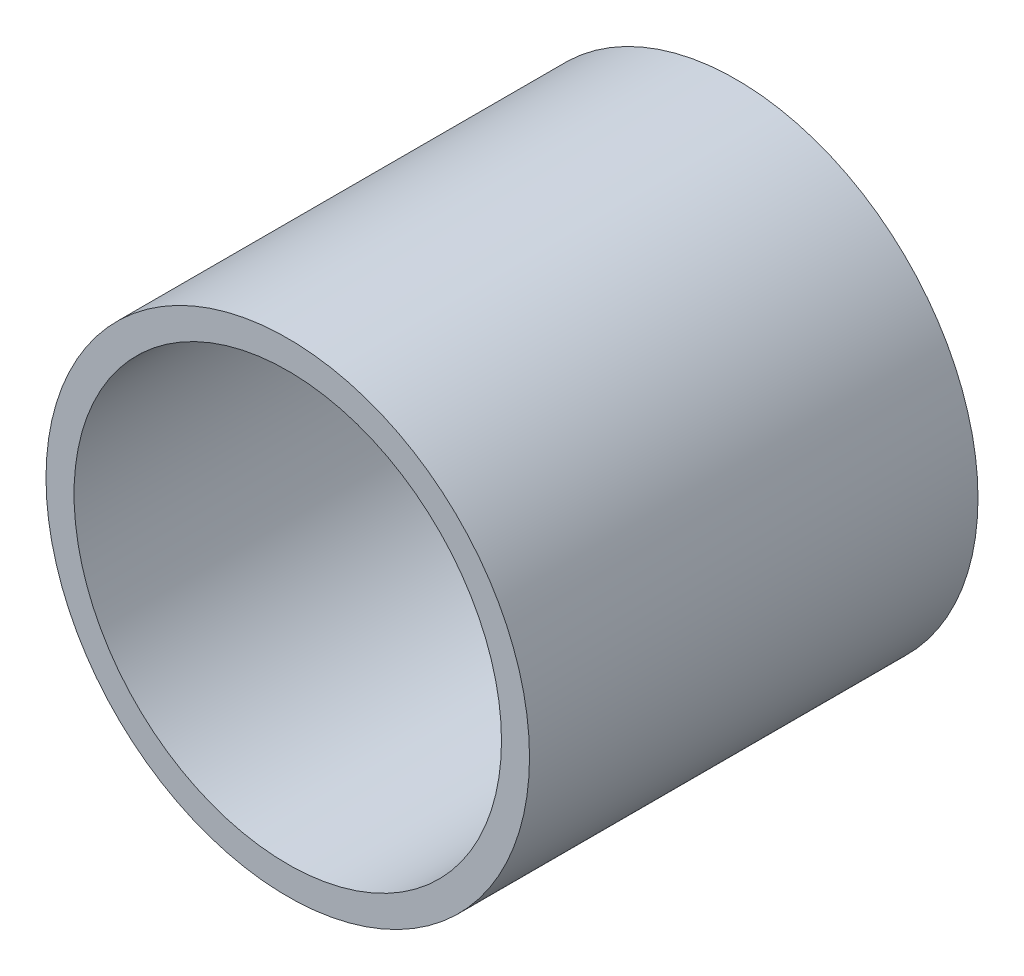
ISO-10303-21;
HEADER;
FILE_DESCRIPTION(('STEP AP214'),'2;1');
FILE_NAME('part.step','',(''),(''),'','','');
FILE_SCHEMA(('AUTOMOTIVE_DESIGN { 1 0 10303 214 1 1 1 1 }'));
ENDSEC;
DATA;
#1=APPLICATION_CONTEXT('core data for automotive mechanical design processes');
#2=APPLICATION_PROTOCOL_DEFINITION('international standard','automotive_design',2000,#1);
#3=PRODUCT_CONTEXT('',#1,'mechanical');
#4=PRODUCT('Part','Part','',(#3));
#5=PRODUCT_RELATED_PRODUCT_CATEGORY('part','',(#4));
#6=PRODUCT_DEFINITION_FORMATION('','',#4);
#7=PRODUCT_DEFINITION_CONTEXT('part definition',#1,'design');
#8=PRODUCT_DEFINITION('design','',#6,#7);
#9=PRODUCT_DEFINITION_SHAPE('','',#8);
#10=(LENGTH_UNIT() NAMED_UNIT(*) SI_UNIT(.MILLI.,.METRE.));
#11=(NAMED_UNIT(*) PLANE_ANGLE_UNIT() SI_UNIT($,.RADIAN.));
#12=(NAMED_UNIT(*) SI_UNIT($,.STERADIAN.) SOLID_ANGLE_UNIT());
#13=UNCERTAINTY_MEASURE_WITH_UNIT(LENGTH_MEASURE(1.E-05),#10,'distance_accuracy_value','');
#14=(GEOMETRIC_REPRESENTATION_CONTEXT(3) GLOBAL_UNCERTAINTY_ASSIGNED_CONTEXT((#13)) GLOBAL_UNIT_ASSIGNED_CONTEXT((#10,
#11,#12)) REPRESENTATION_CONTEXT('',''));
#15=CARTESIAN_POINT('',(0.,0.,0.));
#16=DIRECTION('',(0.,0.,1.));
#17=DIRECTION('',(1.,0.,0.));
#18=AXIS2_PLACEMENT_3D('',#15,#16,#17);
#19=CARTESIAN_POINT('',(0.,0.,101.6));
#20=DIRECTION('',(0.,0.,1.));
#21=DIRECTION('',(1.,0.,0.));
#22=AXIS2_PLACEMENT_3D('',#19,#20,#21);
#23=PLANE('',#22);
#24=CARTESIAN_POINT('',(0.,0.,101.6));
#25=DIRECTION('',(0.,0.,1.));
#26=DIRECTION('',(1.,0.,0.));
#27=AXIS2_PLACEMENT_3D('',#24,#25,#26);
#28=CIRCLE('',#27,109.5375);
#29=CARTESIAN_POINT('',(109.5375,0.,101.6));
#30=VERTEX_POINT('',#29);
#31=EDGE_CURVE('E11',#30,#30,#28,.T.);
#32=ORIENTED_EDGE('',*,*,#31,.T.);
#33=EDGE_LOOP('',(#32));
#34=FACE_BOUND('',#33,.T.);
#35=CARTESIAN_POINT('',(0.,0.,101.6));
#36=DIRECTION('',(0.,0.,1.));
#37=DIRECTION('',(1.,0.,0.));
#38=AXIS2_PLACEMENT_3D('',#35,#36,#37);
#39=CIRCLE('',#38,96.8375);
#40=CARTESIAN_POINT('',(96.8375,0.,101.6));
#41=VERTEX_POINT('',#40);
#42=EDGE_CURVE('E49',#41,#41,#39,.T.);
#43=ORIENTED_EDGE('',*,*,#42,.F.);
#44=EDGE_LOOP('',(#43));
#45=FACE_BOUND('',#44,.T.);
#46=ADVANCED_FACE('F38',(#34,#45),#23,.T.);
#47=CARTESIAN_POINT('',(0.,0.,-101.6));
#48=DIRECTION('',(0.,0.,1.));
#49=DIRECTION('',(1.,0.,0.));
#50=AXIS2_PLACEMENT_3D('',#47,#48,#49);
#51=PLANE('',#50);
#52=CARTESIAN_POINT('',(0.,0.,-101.6));
#53=DIRECTION('',(0.,0.,1.));
#54=DIRECTION('',(1.,0.,0.));
#55=AXIS2_PLACEMENT_3D('',#52,#53,#54);
#56=CIRCLE('',#55,109.5375);
#57=CARTESIAN_POINT('',(109.5375,0.,-101.6));
#58=VERTEX_POINT('',#57);
#59=EDGE_CURVE('E42',#58,#58,#56,.T.);
#60=ORIENTED_EDGE('',*,*,#59,.F.);
#61=EDGE_LOOP('',(#60));
#62=FACE_BOUND('',#61,.T.);
#63=CARTESIAN_POINT('',(0.,0.,-101.6));
#64=DIRECTION('',(0.,0.,1.));
#65=DIRECTION('',(1.,0.,0.));
#66=AXIS2_PLACEMENT_3D('',#63,#64,#65);
#67=CIRCLE('',#66,96.8375);
#68=CARTESIAN_POINT('',(96.8375,0.,-101.6));
#69=VERTEX_POINT('',#68);
#70=EDGE_CURVE('E51',#69,#69,#67,.T.);
#71=ORIENTED_EDGE('',*,*,#70,.T.);
#72=EDGE_LOOP('',(#71));
#73=FACE_BOUND('',#72,.T.);
#74=ADVANCED_FACE('F61',(#62,#73),#51,.F.);
#75=CARTESIAN_POINT('',(0.,0.,101.6));
#76=DIRECTION('',(0.,0.,-1.));
#77=DIRECTION('',(-1.,0.,0.));
#78=AXIS2_PLACEMENT_3D('',#75,#76,#77);
#79=CYLINDRICAL_SURFACE('',#78,109.5375);
#80=ORIENTED_EDGE('',*,*,#31,.F.);
#81=EDGE_LOOP('',(#80));
#82=FACE_BOUND('',#81,.T.);
#83=ORIENTED_EDGE('',*,*,#59,.T.);
#84=EDGE_LOOP('',(#83));
#85=FACE_BOUND('',#84,.T.);
#86=ADVANCED_FACE('F40',(#82,#85),#79,.T.);
#87=CARTESIAN_POINT('',(0.,0.,101.6));
#88=DIRECTION('',(0.,0.,-1.));
#89=DIRECTION('',(-1.,0.,0.));
#90=AXIS2_PLACEMENT_3D('',#87,#88,#89);
#91=CYLINDRICAL_SURFACE('',#90,96.8375);
#92=ORIENTED_EDGE('',*,*,#42,.T.);
#93=EDGE_LOOP('',(#92));
#94=FACE_BOUND('',#93,.T.);
#95=ORIENTED_EDGE('',*,*,#70,.F.);
#96=EDGE_LOOP('',(#95));
#97=FACE_BOUND('',#96,.T.);
#98=ADVANCED_FACE('F57',(#94,#97),#91,.F.);
#99=CLOSED_SHELL('',(#46,#74,#86,#98));
#100=MANIFOLD_SOLID_BREP('B2',#99);
#101=ADVANCED_BREP_SHAPE_REPRESENTATION('',(#18,#100),#14);
#102=SHAPE_DEFINITION_REPRESENTATION(#9,#101);
ENDSEC;
END-ISO-10303-21;
